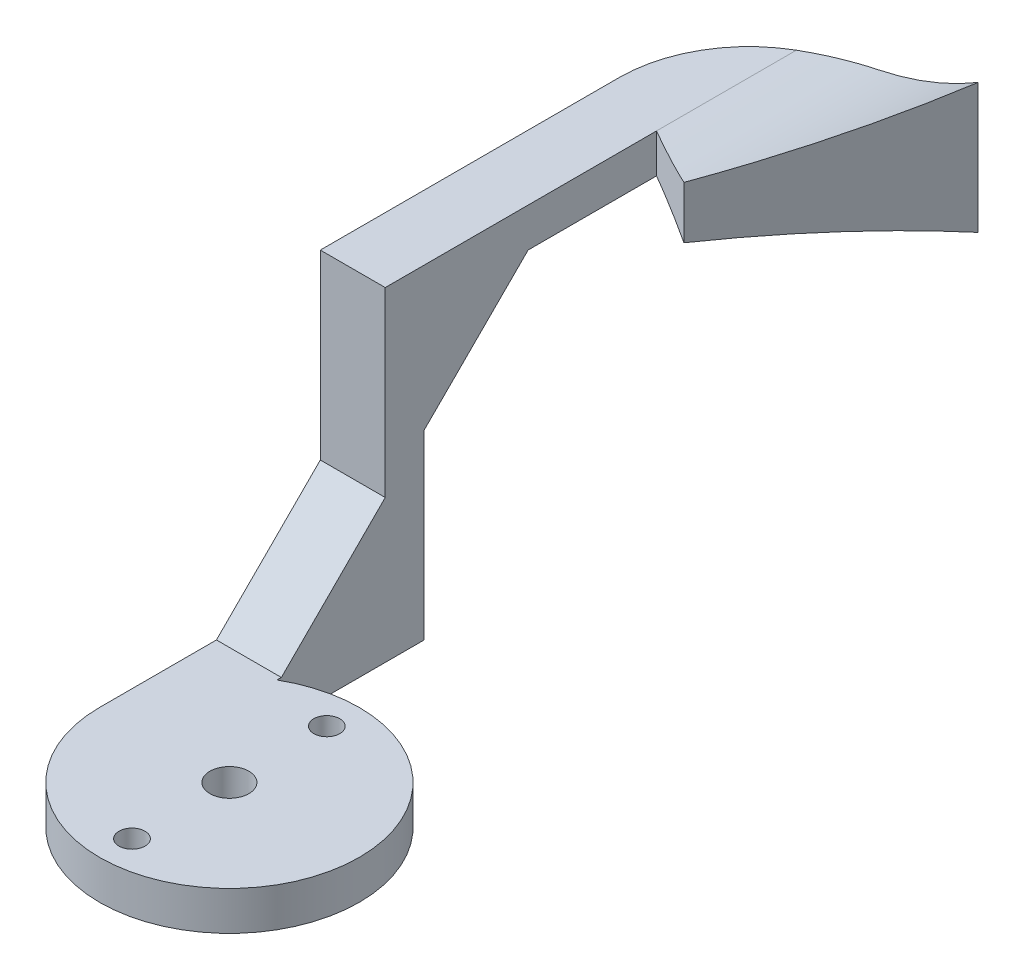
ISO-10303-21;
HEADER;
FILE_DESCRIPTION(('STEP AP214'),'2;1');
FILE_NAME('part.step','',(''),(''),'','','');
FILE_SCHEMA(('AUTOMOTIVE_DESIGN { 1 0 10303 214 1 1 1 1 }'));
ENDSEC;
DATA;
#1=APPLICATION_CONTEXT('core data for automotive mechanical design processes');
#2=APPLICATION_PROTOCOL_DEFINITION('international standard','automotive_design',2000,#1);
#3=PRODUCT_CONTEXT('',#1,'mechanical');
#4=PRODUCT('Part','Part','',(#3));
#5=PRODUCT_RELATED_PRODUCT_CATEGORY('part','',(#4));
#6=PRODUCT_DEFINITION_FORMATION('','',#4);
#7=PRODUCT_DEFINITION_CONTEXT('part definition',#1,'design');
#8=PRODUCT_DEFINITION('design','',#6,#7);
#9=PRODUCT_DEFINITION_SHAPE('','',#8);
#10=(LENGTH_UNIT() NAMED_UNIT(*) SI_UNIT(.MILLI.,.METRE.));
#11=(NAMED_UNIT(*) PLANE_ANGLE_UNIT() SI_UNIT($,.RADIAN.));
#12=(NAMED_UNIT(*) SI_UNIT($,.STERADIAN.) SOLID_ANGLE_UNIT());
#13=UNCERTAINTY_MEASURE_WITH_UNIT(LENGTH_MEASURE(1.E-05),#10,'distance_accuracy_value','');
#14=(GEOMETRIC_REPRESENTATION_CONTEXT(3) GLOBAL_UNCERTAINTY_ASSIGNED_CONTEXT((#13)) GLOBAL_UNIT_ASSIGNED_CONTEXT((#10,
#11,#12)) REPRESENTATION_CONTEXT('',''));
#15=CARTESIAN_POINT('',(0.,0.,0.));
#16=DIRECTION('',(0.,0.,1.));
#17=DIRECTION('',(1.,0.,0.));
#18=AXIS2_PLACEMENT_3D('',#15,#16,#17);
#19=CARTESIAN_POINT('',(-10.,3.,0.));
#20=DIRECTION('',(1.,0.,0.));
#21=DIRECTION('',(0.,0.,-1.));
#22=AXIS2_PLACEMENT_3D('',#19,#20,#21);
#23=PLANE('',#22);
#24=DIRECTION('',(0.,0.,-1.));
#25=VECTOR('',#24,1.);
#26=CARTESIAN_POINT('',(-10.,25.,0.));
#27=LINE('',#26,#25);
#28=CARTESIAN_POINT('',(-10.,25.,-17.));
#29=VERTEX_POINT('',#28);
#30=CARTESIAN_POINT('',(-10.,25.,-40.));
#31=VERTEX_POINT('',#30);
#32=EDGE_CURVE('E196',#29,#31,#27,.T.);
#33=ORIENTED_EDGE('',*,*,#32,.T.);
#34=DIRECTION('',(0.,1.,0.));
#35=VECTOR('',#34,1.);
#36=CARTESIAN_POINT('',(-10.,-12.4818792991333,-40.));
#37=LINE('',#36,#35);
#38=CARTESIAN_POINT('',(-10.,22.,-40.));
#39=VERTEX_POINT('',#38);
#40=EDGE_CURVE('E172',#39,#31,#37,.T.);
#41=ORIENTED_EDGE('',*,*,#40,.F.);
#42=DIRECTION('',(0.,0.,-1.));
#43=VECTOR('',#42,1.);
#44=CARTESIAN_POINT('',(-10.,22.,0.));
#45=LINE('',#44,#43);
#46=CARTESIAN_POINT('',(-10.,22.,-28.0000000000001));
#47=VERTEX_POINT('',#46);
#48=EDGE_CURVE('E198',#47,#39,#45,.T.);
#49=ORIENTED_EDGE('',*,*,#48,.F.);
#50=DIRECTION('',(0.,-0.707106781186544,0.707106781186551));
#51=VECTOR('',#50,1.);
#52=CARTESIAN_POINT('',(-10.,-2.99999999999993,-2.9999999999999));
#53=LINE('',#52,#51);
#54=CARTESIAN_POINT('',(-10.,14.,-20.));
#55=VERTEX_POINT('',#54);
#56=EDGE_CURVE('E182',#47,#55,#53,.T.);
#57=ORIENTED_EDGE('',*,*,#56,.T.);
#58=DIRECTION('',(0.,-1.,0.));
#59=VECTOR('',#58,1.);
#60=CARTESIAN_POINT('',(-10.,3.,-20.));
#61=LINE('',#60,#59);
#62=CARTESIAN_POINT('',(-10.,0.,-20.));
#63=VERTEX_POINT('',#62);
#64=EDGE_CURVE('E236',#55,#63,#61,.T.);
#65=ORIENTED_EDGE('',*,*,#64,.T.);
#66=DIRECTION('',(0.,0.,1.));
#67=VECTOR('',#66,1.);
#68=CARTESIAN_POINT('',(-10.,0.,0.));
#69=LINE('',#68,#67);
#70=CARTESIAN_POINT('',(-10.,0.,0.));
#71=VERTEX_POINT('',#70);
#72=EDGE_CURVE('E222',#63,#71,#69,.T.);
#73=ORIENTED_EDGE('',*,*,#72,.T.);
#74=DIRECTION('',(0.,-1.,0.));
#75=VECTOR('',#74,1.);
#76=CARTESIAN_POINT('',(-10.,3.,0.));
#77=LINE('',#76,#75);
#78=CARTESIAN_POINT('',(-10.,3.,0.));
#79=VERTEX_POINT('',#78);
#80=EDGE_CURVE('E226',#79,#71,#77,.T.);
#81=ORIENTED_EDGE('',*,*,#80,.F.);
#82=DIRECTION('',(0.,0.,1.));
#83=VECTOR('',#82,1.);
#84=CARTESIAN_POINT('',(-10.,3.,0.));
#85=LINE('',#84,#83);
#86=CARTESIAN_POINT('',(-10.,3.,-8.99999999999989));
#87=VERTEX_POINT('',#86);
#88=EDGE_CURVE('E224',#87,#79,#85,.T.);
#89=ORIENTED_EDGE('',*,*,#88,.F.);
#90=DIRECTION('',(0.,-0.707106781186543,0.707106781186552));
#91=VECTOR('',#90,1.);
#92=CARTESIAN_POINT('',(-10.,-2.99999999999993,-2.99999999999989));
#93=LINE('',#92,#91);
#94=CARTESIAN_POINT('',(-10.,11.,-17.));
#95=VERTEX_POINT('',#94);
#96=EDGE_CURVE('E175',#95,#87,#93,.T.);
#97=ORIENTED_EDGE('',*,*,#96,.F.);
#98=DIRECTION('',(0.,1.,0.));
#99=VECTOR('',#98,1.);
#100=CARTESIAN_POINT('',(-10.,0.,-17.));
#101=LINE('',#100,#99);
#102=EDGE_CURVE('E194',#95,#29,#101,.T.);
#103=ORIENTED_EDGE('',*,*,#102,.T.);
#104=EDGE_LOOP('',(#33,#41,#49,#57,#65,#73,#81,#89,#97,#103));
#105=FACE_BOUND('',#104,.T.);
#106=ADVANCED_FACE('F36',(#105),#23,.F.);
#107=CARTESIAN_POINT('',(0.,-12.4818792991333,-40.));
#108=DIRECTION('',(0.,1.,0.));
#109=DIRECTION('',(0.,0.,1.));
#110=AXIS2_PLACEMENT_3D('',#107,#108,#109);
#111=CYLINDRICAL_SURFACE('',#110,9.99999999999999);
#112=ORIENTED_EDGE('',*,*,#40,.T.);
#113=CARTESIAN_POINT('',(0.,25.,-40.));
#114=DIRECTION('',(0.,1.,0.));
#115=DIRECTION('',(0.,0.,1.));
#116=AXIS2_PLACEMENT_3D('',#113,#114,#115);
#117=CIRCLE('',#116,9.99999999999999);
#118=CARTESIAN_POINT('',(-5.,25.,-48.6602540378444));
#119=VERTEX_POINT('',#118);
#120=EDGE_CURVE('E168',#31,#119,#117,.F.);
#121=ORIENTED_EDGE('',*,*,#120,.T.);
#122=CARTESIAN_POINT('',(-5.00000000000001,25.,-48.6602540378444));
#123=CARTESIAN_POINT('',(-4.76780427374726,24.9999714006775,-48.794355888389));
#124=CARTESIAN_POINT('',(-4.53016700286463,25.0032883352668,-48.9190604891211));
#125=CARTESIAN_POINT('',(-4.04576558179695,25.0173383024292,-49.1489604372385));
#126=CARTESIAN_POINT('',(-3.79899883583263,25.0280734598002,-49.254150184041));
#127=CARTESIAN_POINT('',(-3.30402666138643,25.057342961331,-49.4420276477239));
#128=CARTESIAN_POINT('',(-3.05598680798396,25.075690987092,-49.5251799428243));
#129=CARTESIAN_POINT('',(-2.55497067220456,25.120592381275,-49.6716207318108));
#130=CARTESIAN_POINT('',(-2.30199620764166,25.1471427796532,-49.7349163990032));
#131=CARTESIAN_POINT('',(-1.71146035006233,25.2185925493862,-49.8584240534306));
#132=CARTESIAN_POINT('',(-1.37267522194911,25.2666437505436,-49.9112019486332));
#133=CARTESIAN_POINT('',(-0.86114244887352,25.3502638489005,-49.9643626537235));
#134=CARTESIAN_POINT('',(-0.688716605837889,25.3803416252546,-49.9777482297035));
#135=CARTESIAN_POINT('',(-0.344078285002525,25.4442662976743,-49.9955673365444));
#136=CARTESIAN_POINT('',(-0.171865836093102,25.4781136574417,-49.9999997647795));
#137=CARTESIAN_POINT('',(0.,25.5138169810337,-50.));
#138=B_SPLINE_CURVE_WITH_KNOTS('',3,(#122,#123,#124,#125,#126,#127,#128,#129,#130,#131,#132,
#133,#134,#135,#136,#137),.UNSPECIFIED.,.F.,.F.,(4,2,2,2,2,2,2,4),(0.,0.804195556242593,
1.60862155334646,2.39442372995741,3.17994170382442,4.2162091508575,4.74260477274714,
5.26906521899087),.UNSPECIFIED.);
#139=CARTESIAN_POINT('',(0.,25.5138169810337,-50.));
#140=VERTEX_POINT('',#139);
#141=EDGE_CURVE('E336',#119,#140,#138,.T.);
#142=ORIENTED_EDGE('',*,*,#141,.T.);
#143=DIRECTION('',(0.,1.,0.));
#144=VECTOR('',#143,1.);
#145=CARTESIAN_POINT('',(0.,-12.4818792991333,-50.));
#146=LINE('',#145,#144);
#147=CARTESIAN_POINT('',(0.,21.4861830189663,-50.));
#148=VERTEX_POINT('',#147);
#149=EDGE_CURVE('E176',#148,#140,#146,.T.);
#150=ORIENTED_EDGE('',*,*,#149,.F.);
#151=CARTESIAN_POINT('',(0.,21.4861830189663,-50.));
#152=CARTESIAN_POINT('',(-0.262517746514177,21.5407557705343,-50.0000415045389));
#153=CARTESIAN_POINT('',(-0.525969076046815,21.5909590292765,-49.9896640405455));
#154=CARTESIAN_POINT('',(-1.05281929866364,21.6825239117529,-49.9479242579216));
#155=CARTESIAN_POINT('',(-1.31621815667785,21.7238830677488,-49.9165560923865));
#156=CARTESIAN_POINT('',(-1.83482498523233,21.7967733666416,-49.8336581317333));
#157=CARTESIAN_POINT('',(-2.09008145645234,21.828509777686,-49.7826116569452));
#158=CARTESIAN_POINT('',(-2.59661387865083,21.8835654184981,-49.6605076110851));
#159=CARTESIAN_POINT('',(-2.84789122021869,21.9068876537427,-49.589457201437));
#160=CARTESIAN_POINT('',(-3.2601009370102,21.9389065580437,-49.4552349147342));
#161=CARTESIAN_POINT('',(-3.42268848799357,21.9498796471891,-49.3976050194521));
#162=CARTESIAN_POINT('',(-3.74485929821452,21.9684692340454,-49.2739310376327));
#163=CARTESIAN_POINT('',(-3.90444220347491,21.9760853386094,-49.2078859667352));
#164=CARTESIAN_POINT('',(-4.22253489501878,21.988226899739,-49.0664744965941));
#165=CARTESIAN_POINT('',(-4.38098897206747,21.9927022159217,-48.99097859854));
#166=CARTESIAN_POINT('',(-4.6937345730493,21.9985910016761,-48.8317426463199));
#167=CARTESIAN_POINT('',(-4.84802658554491,22.0000048321772,-48.7480035651893));
#168=CARTESIAN_POINT('',(-5.00000000000001,22.,-48.6602540378444));
#169=B_SPLINE_CURVE_WITH_KNOTS('',3,(#151,#152,#153,#154,#155,#156,#157,#158,#159,#160,#161,
#162,#163,#164,#165,#166,#167,#168),.UNSPECIFIED.,.F.,.F.,(4,2,2,2,2,2,2,2,4),(0.,
0.804192014353111,1.60860812757328,2.3944106535297,3.1799322185136,3.69823554748103,
4.21659956042801,4.74306139262274,5.26946115496264),.UNSPECIFIED.);
#170=CARTESIAN_POINT('',(-5.,22.,-48.6602540378444));
#171=VERTEX_POINT('',#170);
#172=EDGE_CURVE('E51',#148,#171,#169,.T.);
#173=ORIENTED_EDGE('',*,*,#172,.T.);
#174=CARTESIAN_POINT('',(0.,22.,-40.));
#175=DIRECTION('',(0.,-1.,0.));
#176=DIRECTION('',(0.,0.,-1.));
#177=AXIS2_PLACEMENT_3D('',#174,#175,#176);
#178=CIRCLE('',#177,9.99999999999999);
#179=EDGE_CURVE('E163',#171,#39,#178,.F.);
#180=ORIENTED_EDGE('',*,*,#179,.T.);
#181=EDGE_LOOP('',(#112,#121,#142,#150,#173,#180));
#182=FACE_BOUND('',#181,.T.);
#183=ADVANCED_FACE('F276',(#182),#111,.T.);
#184=CARTESIAN_POINT('',(-5.,22.,0.));
#185=DIRECTION('',(0.,1.,0.));
#186=DIRECTION('',(0.,0.,1.));
#187=AXIS2_PLACEMENT_3D('',#184,#185,#186);
#188=PLANE('',#187);
#189=ORIENTED_EDGE('',*,*,#48,.T.);
#190=ORIENTED_EDGE('',*,*,#179,.F.);
#191=DIRECTION('',(0.,0.,1.));
#192=VECTOR('',#191,1.);
#193=CARTESIAN_POINT('',(-5.,22.,-50.));
#194=LINE('',#193,#192);
#195=CARTESIAN_POINT('',(-5.,22.,-37.8867513459482));
#196=VERTEX_POINT('',#195);
#197=EDGE_CURVE('E282',#171,#196,#194,.T.);
#198=ORIENTED_EDGE('',*,*,#197,.T.);
#199=DIRECTION('',(0.,0.,-1.));
#200=VECTOR('',#199,1.);
#201=CARTESIAN_POINT('',(-5.,22.,0.));
#202=LINE('',#201,#200);
#203=CARTESIAN_POINT('',(-5.,22.,-28.0000000000001));
#204=VERTEX_POINT('',#203);
#205=EDGE_CURVE('E186',#204,#196,#202,.T.);
#206=ORIENTED_EDGE('',*,*,#205,.F.);
#207=DIRECTION('',(-1.,0.,0.));
#208=VECTOR('',#207,1.);
#209=CARTESIAN_POINT('',(-5.,22.,-28.0000000000001));
#210=LINE('',#209,#208);
#211=EDGE_CURVE('E206',#204,#47,#210,.T.);
#212=ORIENTED_EDGE('',*,*,#211,.T.);
#213=EDGE_LOOP('',(#189,#190,#198,#206,#212));
#214=FACE_BOUND('',#213,.T.);
#215=ADVANCED_FACE('F280',(#214),#188,.F.);
#216=CARTESIAN_POINT('',(-5.,25.,0.));
#217=DIRECTION('',(0.,1.,0.));
#218=DIRECTION('',(0.,0.,1.));
#219=AXIS2_PLACEMENT_3D('',#216,#217,#218);
#220=PLANE('',#219);
#221=DIRECTION('',(0.,0.,-1.));
#222=VECTOR('',#221,1.);
#223=CARTESIAN_POINT('',(-5.,25.,0.));
#224=LINE('',#223,#222);
#225=CARTESIAN_POINT('',(-5.,25.,-17.));
#226=VERTEX_POINT('',#225);
#227=CARTESIAN_POINT('',(-5.,25.,-37.8867513459482));
#228=VERTEX_POINT('',#227);
#229=EDGE_CURVE('E184',#226,#228,#224,.T.);
#230=ORIENTED_EDGE('',*,*,#229,.T.);
#231=DIRECTION('',(0.,0.,1.));
#232=VECTOR('',#231,1.);
#233=CARTESIAN_POINT('',(-5.,25.,-50.));
#234=LINE('',#233,#232);
#235=EDGE_CURVE('E158',#119,#228,#234,.T.);
#236=ORIENTED_EDGE('',*,*,#235,.F.);
#237=ORIENTED_EDGE('',*,*,#120,.F.);
#238=ORIENTED_EDGE('',*,*,#32,.F.);
#239=DIRECTION('',(-1.,0.,0.));
#240=VECTOR('',#239,1.);
#241=CARTESIAN_POINT('',(-5.,25.,-17.));
#242=LINE('',#241,#240);
#243=EDGE_CURVE('E208',#226,#29,#242,.T.);
#244=ORIENTED_EDGE('',*,*,#243,.F.);
#245=EDGE_LOOP('',(#230,#236,#237,#238,#244));
#246=FACE_BOUND('',#245,.T.);
#247=ADVANCED_FACE('F269',(#246),#220,.T.);
#248=CARTESIAN_POINT('',(0.,3.,0.));
#249=DIRECTION('',(0.,1.,0.));
#250=DIRECTION('',(0.,0.,1.));
#251=AXIS2_PLACEMENT_3D('',#248,#249,#250);
#252=PLANE('',#251);
#253=CARTESIAN_POINT('',(0.,3.,-7.5));
#254=DIRECTION('',(0.,1.,0.));
#255=DIRECTION('',(0.,0.,1.));
#256=AXIS2_PLACEMENT_3D('',#253,#254,#255);
#257=CIRCLE('',#256,1.);
#258=CARTESIAN_POINT('',(0.,3.,-8.5));
#259=VERTEX_POINT('',#258);
#260=EDGE_CURVE('E147',#259,#259,#257,.T.);
#261=ORIENTED_EDGE('',*,*,#260,.F.);
#262=EDGE_LOOP('',(#261));
#263=FACE_BOUND('',#262,.T.);
#264=CARTESIAN_POINT('',(0.,3.,7.5));
#265=DIRECTION('',(0.,1.,0.));
#266=DIRECTION('',(0.,0.,1.));
#267=AXIS2_PLACEMENT_3D('',#264,#265,#266);
#268=CIRCLE('',#267,1.);
#269=CARTESIAN_POINT('',(0.,3.,6.5));
#270=VERTEX_POINT('',#269);
#271=EDGE_CURVE('E549',#270,#270,#268,.T.);
#272=ORIENTED_EDGE('',*,*,#271,.F.);
#273=EDGE_LOOP('',(#272));
#274=FACE_BOUND('',#273,.T.);
#275=CARTESIAN_POINT('',(0.,3.,0.));
#276=DIRECTION('',(0.,1.,0.));
#277=DIRECTION('',(0.,0.,1.));
#278=AXIS2_PLACEMENT_3D('',#275,#276,#277);
#279=CIRCLE('',#278,1.5);
#280=CARTESIAN_POINT('',(0.,3.,1.5));
#281=VERTEX_POINT('',#280);
#282=EDGE_CURVE('E214',#281,#281,#279,.T.);
#283=ORIENTED_EDGE('',*,*,#282,.F.);
#284=EDGE_LOOP('',(#283));
#285=FACE_BOUND('',#284,.T.);
#286=DIRECTION('',(0.,0.,-1.));
#287=VECTOR('',#286,1.);
#288=CARTESIAN_POINT('',(-5.,3.,-20.));
#289=LINE('',#288,#287);
#290=CARTESIAN_POINT('',(-5.,3.,-8.66025403784439));
#291=VERTEX_POINT('',#290);
#292=CARTESIAN_POINT('',(-5.,3.,-8.99999999999989));
#293=VERTEX_POINT('',#292);
#294=EDGE_CURVE('E59',#291,#293,#289,.T.);
#295=ORIENTED_EDGE('',*,*,#294,.T.);
#296=DIRECTION('',(-1.,0.,0.));
#297=VECTOR('',#296,1.);
#298=CARTESIAN_POINT('',(-5.,3.,-8.99999999999989));
#299=LINE('',#298,#297);
#300=EDGE_CURVE('E191',#293,#87,#299,.T.);
#301=ORIENTED_EDGE('',*,*,#300,.T.);
#302=ORIENTED_EDGE('',*,*,#88,.T.);
#303=CARTESIAN_POINT('',(0.,3.,0.));
#304=DIRECTION('',(0.,1.,0.));
#305=DIRECTION('',(0.,0.,1.));
#306=AXIS2_PLACEMENT_3D('',#303,#304,#305);
#307=CIRCLE('',#306,10.);
#308=EDGE_CURVE('E220',#79,#291,#307,.T.);
#309=ORIENTED_EDGE('',*,*,#308,.T.);
#310=EDGE_LOOP('',(#295,#301,#302,#309));
#311=FACE_BOUND('',#310,.T.);
#312=ADVANCED_FACE('F255',(#263,#274,#285,#311),#252,.T.);
#313=CARTESIAN_POINT('',(0.,0.,0.));
#314=DIRECTION('',(0.,1.,0.));
#315=DIRECTION('',(0.,0.,1.));
#316=AXIS2_PLACEMENT_3D('',#313,#314,#315);
#317=PLANE('',#316);
#318=CARTESIAN_POINT('',(0.,0.,-7.5));
#319=DIRECTION('',(0.,-1.,0.));
#320=DIRECTION('',(0.,0.,-1.));
#321=AXIS2_PLACEMENT_3D('',#318,#319,#320);
#322=CIRCLE('',#321,1.);
#323=CARTESIAN_POINT('',(0.,0.,-8.5));
#324=VERTEX_POINT('',#323);
#325=EDGE_CURVE('E543',#324,#324,#322,.T.);
#326=ORIENTED_EDGE('',*,*,#325,.F.);
#327=EDGE_LOOP('',(#326));
#328=FACE_BOUND('',#327,.T.);
#329=CARTESIAN_POINT('',(0.,0.,7.5));
#330=DIRECTION('',(0.,-1.,0.));
#331=DIRECTION('',(0.,0.,-1.));
#332=AXIS2_PLACEMENT_3D('',#329,#330,#331);
#333=CIRCLE('',#332,1.);
#334=CARTESIAN_POINT('',(0.,0.,6.5));
#335=VERTEX_POINT('',#334);
#336=EDGE_CURVE('E546',#335,#335,#333,.T.);
#337=ORIENTED_EDGE('',*,*,#336,.F.);
#338=EDGE_LOOP('',(#337));
#339=FACE_BOUND('',#338,.T.);
#340=DIRECTION('',(-1.,0.,0.));
#341=VECTOR('',#340,1.);
#342=CARTESIAN_POINT('',(-10.,0.,-20.));
#343=LINE('',#342,#341);
#344=CARTESIAN_POINT('',(-5.,0.,-20.));
#345=VERTEX_POINT('',#344);
#346=EDGE_CURVE('E231',#345,#63,#343,.T.);
#347=ORIENTED_EDGE('',*,*,#346,.F.);
#348=DIRECTION('',(0.,0.,-1.));
#349=VECTOR('',#348,1.);
#350=CARTESIAN_POINT('',(-5.,0.,-20.));
#351=LINE('',#350,#349);
#352=CARTESIAN_POINT('',(-5.,0.,-8.66025403784439));
#353=VERTEX_POINT('',#352);
#354=EDGE_CURVE('E229',#353,#345,#351,.T.);
#355=ORIENTED_EDGE('',*,*,#354,.F.);
#356=CARTESIAN_POINT('',(0.,0.,0.));
#357=DIRECTION('',(0.,1.,0.));
#358=DIRECTION('',(0.,0.,1.));
#359=AXIS2_PLACEMENT_3D('',#356,#357,#358);
#360=CIRCLE('',#359,10.);
#361=EDGE_CURVE('E217',#71,#353,#360,.T.);
#362=ORIENTED_EDGE('',*,*,#361,.F.);
#363=ORIENTED_EDGE('',*,*,#72,.F.);
#364=EDGE_LOOP('',(#347,#355,#362,#363));
#365=FACE_BOUND('',#364,.T.);
#366=CARTESIAN_POINT('',(0.,0.,0.));
#367=DIRECTION('',(0.,1.,0.));
#368=DIRECTION('',(0.,0.,1.));
#369=AXIS2_PLACEMENT_3D('',#366,#367,#368);
#370=CIRCLE('',#369,1.5);
#371=CARTESIAN_POINT('',(0.,0.,1.5));
#372=VERTEX_POINT('',#371);
#373=EDGE_CURVE('E205',#372,#372,#370,.T.);
#374=ORIENTED_EDGE('',*,*,#373,.T.);
#375=EDGE_LOOP('',(#374));
#376=FACE_BOUND('',#375,.T.);
#377=ADVANCED_FACE('F247',(#328,#339,#365,#376),#317,.F.);
#378=CARTESIAN_POINT('',(0.,3.,0.));
#379=DIRECTION('',(0.,-1.,0.));
#380=DIRECTION('',(0.,0.,-1.));
#381=AXIS2_PLACEMENT_3D('',#378,#379,#380);
#382=CYLINDRICAL_SURFACE('',#381,10.);
#383=ORIENTED_EDGE('',*,*,#361,.T.);
#384=DIRECTION('',(0.,-1.,0.));
#385=VECTOR('',#384,1.);
#386=CARTESIAN_POINT('',(-5.,3.,-8.66025403784439));
#387=LINE('',#386,#385);
#388=EDGE_CURVE('E12',#291,#353,#387,.T.);
#389=ORIENTED_EDGE('',*,*,#388,.F.);
#390=ORIENTED_EDGE('',*,*,#308,.F.);
#391=ORIENTED_EDGE('',*,*,#80,.T.);
#392=EDGE_LOOP('',(#383,#389,#390,#391));
#393=FACE_BOUND('',#392,.T.);
#394=ADVANCED_FACE('F38',(#393),#382,.T.);
#395=CARTESIAN_POINT('',(-5.,3.,-20.));
#396=DIRECTION('',(-1.,0.,0.));
#397=DIRECTION('',(0.,0.,1.));
#398=AXIS2_PLACEMENT_3D('',#395,#396,#397);
#399=PLANE('',#398);
#400=ORIENTED_EDGE('',*,*,#229,.F.);
#401=DIRECTION('',(0.,1.,0.));
#402=VECTOR('',#401,1.);
#403=CARTESIAN_POINT('',(-5.,0.,-17.));
#404=LINE('',#403,#402);
#405=CARTESIAN_POINT('',(-5.,11.,-17.));
#406=VERTEX_POINT('',#405);
#407=EDGE_CURVE('E181',#406,#226,#404,.T.);
#408=ORIENTED_EDGE('',*,*,#407,.F.);
#409=DIRECTION('',(0.,-0.707106781186543,0.707106781186552));
#410=VECTOR('',#409,1.);
#411=CARTESIAN_POINT('',(-5.,-2.99999999999993,-2.99999999999989));
#412=LINE('',#411,#410);
#413=EDGE_CURVE('E179',#406,#293,#412,.T.);
#414=ORIENTED_EDGE('',*,*,#413,.T.);
#415=ORIENTED_EDGE('',*,*,#294,.F.);
#416=ORIENTED_EDGE('',*,*,#388,.T.);
#417=ORIENTED_EDGE('',*,*,#354,.T.);
#418=DIRECTION('',(0.,-1.,0.));
#419=VECTOR('',#418,1.);
#420=CARTESIAN_POINT('',(-5.,3.,-20.));
#421=LINE('',#420,#419);
#422=CARTESIAN_POINT('',(-5.,14.,-20.));
#423=VERTEX_POINT('',#422);
#424=EDGE_CURVE('E44',#423,#345,#421,.T.);
#425=ORIENTED_EDGE('',*,*,#424,.F.);
#426=DIRECTION('',(0.,-0.707106781186544,0.707106781186551));
#427=VECTOR('',#426,1.);
#428=CARTESIAN_POINT('',(-5.,-2.99999999999993,-2.9999999999999));
#429=LINE('',#428,#427);
#430=EDGE_CURVE('E188',#204,#423,#429,.T.);
#431=ORIENTED_EDGE('',*,*,#430,.F.);
#432=ORIENTED_EDGE('',*,*,#205,.T.);
#433=DIRECTION('',(0.,1.,0.));
#434=VECTOR('',#433,1.);
#435=CARTESIAN_POINT('',(-5.,-12.4818792991333,-37.8867513459482));
#436=LINE('',#435,#434);
#437=EDGE_CURVE('E162',#196,#228,#436,.T.);
#438=ORIENTED_EDGE('',*,*,#437,.T.);
#439=EDGE_LOOP('',(#400,#408,#414,#415,#416,#417,#425,#431,#432,#438));
#440=FACE_BOUND('',#439,.T.);
#441=ADVANCED_FACE('F328',(#440),#399,.F.);
#442=CARTESIAN_POINT('',(-10.,3.,-20.));
#443=DIRECTION('',(0.,0.,1.));
#444=DIRECTION('',(1.,0.,0.));
#445=AXIS2_PLACEMENT_3D('',#442,#443,#444);
#446=PLANE('',#445);
#447=ORIENTED_EDGE('',*,*,#346,.T.);
#448=ORIENTED_EDGE('',*,*,#64,.F.);
#449=DIRECTION('',(-1.,0.,0.));
#450=VECTOR('',#449,1.);
#451=CARTESIAN_POINT('',(-5.,14.,-20.));
#452=LINE('',#451,#450);
#453=EDGE_CURVE('E202',#423,#55,#452,.T.);
#454=ORIENTED_EDGE('',*,*,#453,.F.);
#455=ORIENTED_EDGE('',*,*,#424,.T.);
#456=EDGE_LOOP('',(#447,#448,#454,#455));
#457=FACE_BOUND('',#456,.T.);
#458=ADVANCED_FACE('F242',(#457),#446,.F.);
#459=CARTESIAN_POINT('',(0.,3.,0.));
#460=DIRECTION('',(0.,-1.,0.));
#461=DIRECTION('',(0.,0.,-1.));
#462=AXIS2_PLACEMENT_3D('',#459,#460,#461);
#463=CYLINDRICAL_SURFACE('',#462,1.5);
#464=ORIENTED_EDGE('',*,*,#282,.T.);
#465=EDGE_LOOP('',(#464));
#466=FACE_BOUND('',#465,.T.);
#467=ORIENTED_EDGE('',*,*,#373,.F.);
#468=EDGE_LOOP('',(#467));
#469=FACE_BOUND('',#468,.T.);
#470=ADVANCED_FACE('F327',(#466,#469),#463,.F.);
#471=CARTESIAN_POINT('',(-5.,-2.99999999999993,-2.9999999999999));
#472=DIRECTION('',(0.,-0.707106781186551,-0.707106781186544));
#473=DIRECTION('',(0.,0.707106781186544,-0.707106781186551));
#474=AXIS2_PLACEMENT_3D('',#471,#472,#473);
#475=PLANE('',#474);
#476=ORIENTED_EDGE('',*,*,#56,.F.);
#477=ORIENTED_EDGE('',*,*,#211,.F.);
#478=ORIENTED_EDGE('',*,*,#430,.T.);
#479=ORIENTED_EDGE('',*,*,#453,.T.);
#480=EDGE_LOOP('',(#476,#477,#478,#479));
#481=FACE_BOUND('',#480,.T.);
#482=ADVANCED_FACE('F445',(#481),#475,.T.);
#483=CARTESIAN_POINT('',(-5.,0.,-17.));
#484=DIRECTION('',(0.,0.,1.));
#485=DIRECTION('',(1.,0.,0.));
#486=AXIS2_PLACEMENT_3D('',#483,#484,#485);
#487=PLANE('',#486);
#488=ORIENTED_EDGE('',*,*,#243,.T.);
#489=ORIENTED_EDGE('',*,*,#102,.F.);
#490=DIRECTION('',(-1.,0.,0.));
#491=VECTOR('',#490,1.);
#492=CARTESIAN_POINT('',(-5.,11.,-17.));
#493=LINE('',#492,#491);
#494=EDGE_CURVE('E211',#406,#95,#493,.T.);
#495=ORIENTED_EDGE('',*,*,#494,.F.);
#496=ORIENTED_EDGE('',*,*,#407,.T.);
#497=EDGE_LOOP('',(#488,#489,#495,#496));
#498=FACE_BOUND('',#497,.T.);
#499=ADVANCED_FACE('F261',(#498),#487,.T.);
#500=CARTESIAN_POINT('',(-5.,-2.99999999999993,-2.99999999999989));
#501=DIRECTION('',(0.,-0.707106781186552,-0.707106781186543));
#502=DIRECTION('',(0.,0.707106781186543,-0.707106781186552));
#503=AXIS2_PLACEMENT_3D('',#500,#501,#502);
#504=PLANE('',#503);
#505=ORIENTED_EDGE('',*,*,#96,.T.);
#506=ORIENTED_EDGE('',*,*,#300,.F.);
#507=ORIENTED_EDGE('',*,*,#413,.F.);
#508=ORIENTED_EDGE('',*,*,#494,.T.);
#509=EDGE_LOOP('',(#505,#506,#507,#508));
#510=FACE_BOUND('',#509,.T.);
#511=ADVANCED_FACE('F316',(#510),#504,.F.);
#512=CARTESIAN_POINT('',(0.,-12.4818792991333,-35.));
#513=DIRECTION('',(-0.500000000000004,0.,0.866025403784436));
#514=DIRECTION('',(0.866025403784437,0.,0.500000000000004));
#515=AXIS2_PLACEMENT_3D('',#512,#513,#514);
#516=PLANE('',#515);
#517=DIRECTION('',(0.,1.,0.));
#518=VECTOR('',#517,1.);
#519=CARTESIAN_POINT('',(0.,-12.4818792991333,-35.));
#520=LINE('',#519,#518);
#521=CARTESIAN_POINT('',(0.,21.4861830189663,-35.));
#522=VERTEX_POINT('',#521);
#523=CARTESIAN_POINT('',(0.,25.5138169810337,-35.));
#524=VERTEX_POINT('',#523);
#525=EDGE_CURVE('E156',#522,#524,#520,.T.);
#526=ORIENTED_EDGE('',*,*,#525,.T.);
#527=CARTESIAN_POINT('',(-5.,49.5846369646753,-37.8867513459482));
#528=DIRECTION('',(-0.500000000000004,0.,0.866025403784436));
#529=DIRECTION('',(0.866025403784437,0.,0.500000000000004));
#530=AXIS2_PLACEMENT_3D('',#527,#528,#529);
#531=ELLIPSE('',#530,28.3878935389691,24.5846369646753);
#532=EDGE_CURVE('E335',#524,#228,#531,.F.);
#533=ORIENTED_EDGE('',*,*,#532,.T.);
#534=ORIENTED_EDGE('',*,*,#437,.F.);
#535=CARTESIAN_POINT('',(-4.99999999999999,-2.58463696467534,-37.8867513459482));
#536=DIRECTION('',(-0.500000000000004,0.,0.866025403784436));
#537=DIRECTION('',(0.866025403784437,0.,0.500000000000004));
#538=AXIS2_PLACEMENT_3D('',#535,#536,#537);
#539=ELLIPSE('',#538,28.3878935389691,24.5846369646753);
#540=EDGE_CURVE('E157',#196,#522,#539,.F.);
#541=ORIENTED_EDGE('',*,*,#540,.T.);
#542=EDGE_LOOP('',(#526,#533,#534,#541));
#543=FACE_BOUND('',#542,.T.);
#544=ADVANCED_FACE('F312',(#543),#516,.T.);
#545=CARTESIAN_POINT('',(7.64288174241645,28.5,-50.));
#546=DIRECTION('',(-0.891006524188367,0.,-0.453990499739548));
#547=DIRECTION('',(-0.453990499739548,0.,0.891006524188367));
#548=AXIS2_PLACEMENT_3D('',#545,#546,#547);
#549=PLANE('',#548);
#550=CARTESIAN_POINT('',(-5.,49.5846369646753,-25.1869474724743));
#551=DIRECTION('',(-0.891006524188367,0.,-0.453990499739548));
#552=DIRECTION('',(-0.453990499739548,0.,0.891006524188367));
#553=AXIS2_PLACEMENT_3D('',#550,#551,#552);
#554=ELLIPSE('',#553,54.1523159158164,24.5846369646753);
#555=CARTESIAN_POINT('',(7.64288174241646,28.5,-50.));
#556=VERTEX_POINT('',#555);
#557=EDGE_CURVE('E297',#524,#556,#554,.F.);
#558=ORIENTED_EDGE('',*,*,#557,.F.);
#559=ORIENTED_EDGE('',*,*,#525,.F.);
#560=CARTESIAN_POINT('',(-4.99999999999999,-2.58463696467534,-25.1869474724743));
#561=DIRECTION('',(-0.891006524188367,0.,-0.453990499739548));
#562=DIRECTION('',(-0.453990499739548,0.,0.891006524188367));
#563=AXIS2_PLACEMENT_3D('',#560,#561,#562);
#564=ELLIPSE('',#563,54.1523159158163,24.5846369646753);
#565=CARTESIAN_POINT('',(7.64288174241645,18.5,-50.));
#566=VERTEX_POINT('',#565);
#567=EDGE_CURVE('E140',#566,#522,#564,.F.);
#568=ORIENTED_EDGE('',*,*,#567,.F.);
#569=DIRECTION('',(0.,-1.,0.));
#570=VECTOR('',#569,1.);
#571=CARTESIAN_POINT('',(7.64288174241645,28.5,-50.));
#572=LINE('',#571,#570);
#573=EDGE_CURVE('E154',#556,#566,#572,.T.);
#574=ORIENTED_EDGE('',*,*,#573,.F.);
#575=EDGE_LOOP('',(#558,#559,#568,#574));
#576=FACE_BOUND('',#575,.T.);
#577=ADVANCED_FACE('F153',(#576),#549,.F.);
#578=CARTESIAN_POINT('',(0.,28.5,-50.));
#579=DIRECTION('',(0.,0.,1.));
#580=DIRECTION('',(1.,0.,0.));
#581=AXIS2_PLACEMENT_3D('',#578,#579,#580);
#582=PLANE('',#581);
#583=CARTESIAN_POINT('',(-5.,49.5846369646753,-50.));
#584=DIRECTION('',(0.,0.,-1.));
#585=DIRECTION('',(1.,0.,0.));
#586=AXIS2_PLACEMENT_3D('',#583,#584,#585);
#587=CIRCLE('',#586,24.5846369646753);
#588=EDGE_CURVE('E146',#556,#140,#587,.T.);
#589=ORIENTED_EDGE('',*,*,#588,.F.);
#590=ORIENTED_EDGE('',*,*,#573,.T.);
#591=CARTESIAN_POINT('',(-4.99999999999999,-2.58463696467534,-50.));
#592=DIRECTION('',(0.,0.,-1.));
#593=DIRECTION('',(-1.,0.,0.));
#594=AXIS2_PLACEMENT_3D('',#591,#592,#593);
#595=CIRCLE('',#594,24.5846369646753);
#596=EDGE_CURVE('E136',#148,#566,#595,.T.);
#597=ORIENTED_EDGE('',*,*,#596,.F.);
#598=ORIENTED_EDGE('',*,*,#149,.T.);
#599=EDGE_LOOP('',(#589,#590,#597,#598));
#600=FACE_BOUND('',#599,.T.);
#601=ADVANCED_FACE('F161',(#600),#582,.F.);
#602=CARTESIAN_POINT('',(-5.,49.5846369646753,-50.));
#603=DIRECTION('',(0.,0.,1.));
#604=DIRECTION('',(1.,0.,0.));
#605=AXIS2_PLACEMENT_3D('',#602,#603,#604);
#606=CYLINDRICAL_SURFACE('',#605,24.5846369646753);
#607=ORIENTED_EDGE('',*,*,#235,.T.);
#608=ORIENTED_EDGE('',*,*,#532,.F.);
#609=ORIENTED_EDGE('',*,*,#557,.T.);
#610=ORIENTED_EDGE('',*,*,#588,.T.);
#611=ORIENTED_EDGE('',*,*,#141,.F.);
#612=EDGE_LOOP('',(#607,#608,#609,#610,#611));
#613=FACE_BOUND('',#612,.T.);
#614=ADVANCED_FACE('F307',(#613),#606,.F.);
#615=CARTESIAN_POINT('',(-4.99999999999999,-2.58463696467534,-50.));
#616=DIRECTION('',(0.,0.,1.));
#617=DIRECTION('',(1.,0.,0.));
#618=AXIS2_PLACEMENT_3D('',#615,#616,#617);
#619=CYLINDRICAL_SURFACE('',#618,24.5846369646753);
#620=ORIENTED_EDGE('',*,*,#596,.T.);
#621=ORIENTED_EDGE('',*,*,#567,.T.);
#622=ORIENTED_EDGE('',*,*,#540,.F.);
#623=ORIENTED_EDGE('',*,*,#197,.F.);
#624=ORIENTED_EDGE('',*,*,#172,.F.);
#625=EDGE_LOOP('',(#620,#621,#622,#623,#624));
#626=FACE_BOUND('',#625,.T.);
#627=ADVANCED_FACE('F138',(#626),#619,.F.);
#628=CARTESIAN_POINT('',(0.,28.5,7.5));
#629=DIRECTION('',(0.,-1.,0.));
#630=DIRECTION('',(0.,0.,-1.));
#631=AXIS2_PLACEMENT_3D('',#628,#629,#630);
#632=CYLINDRICAL_SURFACE('',#631,1.);
#633=CARTESIAN_POINT('',(0.,3.,6.5));
#634=CARTESIAN_POINT('',(0.,2.96875,6.5));
#635=CARTESIAN_POINT('',(0.,2.9375,6.5));
#636=CARTESIAN_POINT('',(0.,2.875,6.5));
#637=CARTESIAN_POINT('',(0.,2.84375,6.5));
#638=CARTESIAN_POINT('',(0.,2.78125,6.5));
#639=CARTESIAN_POINT('',(0.,2.75,6.5));
#640=CARTESIAN_POINT('',(0.,2.6875,6.5));
#641=CARTESIAN_POINT('',(0.,2.65625,6.5));
#642=CARTESIAN_POINT('',(0.,2.59375,6.5));
#643=CARTESIAN_POINT('',(0.,2.5625,6.5));
#644=CARTESIAN_POINT('',(0.,2.5,6.5));
#645=CARTESIAN_POINT('',(0.,2.46875,6.5));
#646=CARTESIAN_POINT('',(0.,2.40625,6.5));
#647=CARTESIAN_POINT('',(0.,2.375,6.5));
#648=CARTESIAN_POINT('',(0.,2.3125,6.5));
#649=CARTESIAN_POINT('',(0.,2.28125,6.5));
#650=CARTESIAN_POINT('',(0.,2.21875,6.5));
#651=CARTESIAN_POINT('',(0.,2.1875,6.5));
#652=CARTESIAN_POINT('',(0.,2.125,6.5));
#653=CARTESIAN_POINT('',(0.,2.09375,6.5));
#654=CARTESIAN_POINT('',(0.,2.03125,6.5));
#655=CARTESIAN_POINT('',(0.,2.,6.5));
#656=CARTESIAN_POINT('',(0.,1.9375,6.5));
#657=CARTESIAN_POINT('',(0.,1.90625,6.5));
#658=CARTESIAN_POINT('',(0.,1.84375,6.5));
#659=CARTESIAN_POINT('',(0.,1.8125,6.5));
#660=CARTESIAN_POINT('',(0.,1.75,6.5));
#661=CARTESIAN_POINT('',(0.,1.71875,6.5));
#662=CARTESIAN_POINT('',(0.,1.65625,6.5));
#663=CARTESIAN_POINT('',(0.,1.625,6.5));
#664=CARTESIAN_POINT('',(0.,1.5625,6.5));
#665=CARTESIAN_POINT('',(0.,1.53125,6.5));
#666=CARTESIAN_POINT('',(0.,1.46875,6.5));
#667=CARTESIAN_POINT('',(0.,1.4375,6.5));
#668=CARTESIAN_POINT('',(0.,1.375,6.5));
#669=CARTESIAN_POINT('',(0.,1.34375,6.5));
#670=CARTESIAN_POINT('',(0.,1.28125,6.5));
#671=CARTESIAN_POINT('',(0.,1.25,6.5));
#672=CARTESIAN_POINT('',(0.,1.1875,6.5));
#673=CARTESIAN_POINT('',(0.,1.15625,6.5));
#674=CARTESIAN_POINT('',(0.,1.09375,6.5));
#675=CARTESIAN_POINT('',(0.,1.0625,6.5));
#676=CARTESIAN_POINT('',(0.,0.999999999999997,6.5));
#677=CARTESIAN_POINT('',(0.,0.968749999999997,6.5));
#678=CARTESIAN_POINT('',(0.,0.906249999999997,6.5));
#679=CARTESIAN_POINT('',(0.,0.874999999999997,6.5));
#680=CARTESIAN_POINT('',(0.,0.812499999999998,6.5));
#681=CARTESIAN_POINT('',(0.,0.78125,6.5));
#682=CARTESIAN_POINT('',(0.,0.718749999999999,6.5));
#683=CARTESIAN_POINT('',(0.,0.687499999999998,6.5));
#684=CARTESIAN_POINT('',(0.,0.624999999999998,6.5));
#685=CARTESIAN_POINT('',(0.,0.593749999999999,6.5));
#686=CARTESIAN_POINT('',(0.,0.53125,6.5));
#687=CARTESIAN_POINT('',(0.,0.5,6.5));
#688=CARTESIAN_POINT('',(0.,0.4375,6.5));
#689=CARTESIAN_POINT('',(0.,0.40625,6.5));
#690=CARTESIAN_POINT('',(0.,0.34375,6.5));
#691=CARTESIAN_POINT('',(0.,0.3125,6.5));
#692=CARTESIAN_POINT('',(0.,0.25,6.5));
#693=CARTESIAN_POINT('',(0.,0.21875,6.5));
#694=CARTESIAN_POINT('',(0.,0.15625,6.5));
#695=CARTESIAN_POINT('',(0.,0.125,6.5));
#696=CARTESIAN_POINT('',(0.,0.0625000000000001,6.5));
#697=CARTESIAN_POINT('',(0.,0.03125,6.5));
#698=CARTESIAN_POINT('',(0.,0.,6.5));
#699=B_SPLINE_CURVE_WITH_KNOTS('',3,(#633,#634,#635,#636,#637,#638,#639,#640,#641,#642,#643,
#644,#645,#646,#647,#648,#649,#650,#651,#652,#653,#654,#655,#656,#657,#658,#659,#660,#661,#662,
#663,#664,#665,#666,#667,#668,#669,#670,#671,#672,#673,#674,#675,#676,#677,#678,#679,#680,#681,
#682,#683,#684,#685,#686,#687,#688,#689,#690,#691,#692,#693,#694,#695,#696,#697,#698),
.UNSPECIFIED.,.F.,.F.,(4,2,2,2,2,2,2,2,2,2,2,2,2,2,2,2,2,2,2,2,2,2,2,2,2,2,2,2,2,2,2,2,4),(0.,
0.0937500000000001,0.1875,0.28125,0.375,0.46875,0.5625,0.656250000000001,0.750000000000001,
0.843749999999997,0.937499999999997,1.03125,1.125,1.21875,1.3125,1.40625,1.5,1.59375,1.6875,
1.78125,1.875,1.96875,2.0625,2.15625,2.25,2.34375,2.4375,2.53125,2.625,2.71875,2.8125,2.90625,
3.),.UNSPECIFIED.);
#700=EDGE_CURVE('BSEAM306',#270,#335,#699,.T.);
#701=ORIENTED_EDGE('',*,*,#271,.T.);
#702=ORIENTED_EDGE('',*,*,#336,.T.);
#703=ORIENTED_EDGE('',*,*,#700,.T.);
#704=ORIENTED_EDGE('',*,*,#700,.F.);
#705=EDGE_LOOP('',(#701,#703,#702,#704));
#706=FACE_BOUND('',#705,.T.);
#707=ADVANCED_FACE('F306',(#706),#632,.F.);
#708=CARTESIAN_POINT('',(0.,28.5,-7.5));
#709=DIRECTION('',(0.,-1.,0.));
#710=DIRECTION('',(0.,0.,-1.));
#711=AXIS2_PLACEMENT_3D('',#708,#709,#710);
#712=CYLINDRICAL_SURFACE('',#711,1.);
#713=CARTESIAN_POINT('',(0.,3.,-8.5));
#714=CARTESIAN_POINT('',(0.,2.96875,-8.5));
#715=CARTESIAN_POINT('',(0.,2.9375,-8.5));
#716=CARTESIAN_POINT('',(0.,2.875,-8.5));
#717=CARTESIAN_POINT('',(0.,2.84375,-8.5));
#718=CARTESIAN_POINT('',(0.,2.78125,-8.5));
#719=CARTESIAN_POINT('',(0.,2.75,-8.5));
#720=CARTESIAN_POINT('',(0.,2.6875,-8.5));
#721=CARTESIAN_POINT('',(0.,2.65625,-8.5));
#722=CARTESIAN_POINT('',(0.,2.59375,-8.5));
#723=CARTESIAN_POINT('',(0.,2.5625,-8.5));
#724=CARTESIAN_POINT('',(0.,2.5,-8.5));
#725=CARTESIAN_POINT('',(0.,2.46875,-8.5));
#726=CARTESIAN_POINT('',(0.,2.40625,-8.5));
#727=CARTESIAN_POINT('',(0.,2.375,-8.5));
#728=CARTESIAN_POINT('',(0.,2.3125,-8.5));
#729=CARTESIAN_POINT('',(0.,2.28125,-8.5));
#730=CARTESIAN_POINT('',(0.,2.21875,-8.5));
#731=CARTESIAN_POINT('',(0.,2.1875,-8.5));
#732=CARTESIAN_POINT('',(0.,2.125,-8.5));
#733=CARTESIAN_POINT('',(0.,2.09375,-8.5));
#734=CARTESIAN_POINT('',(0.,2.03125,-8.5));
#735=CARTESIAN_POINT('',(0.,2.,-8.5));
#736=CARTESIAN_POINT('',(0.,1.9375,-8.5));
#737=CARTESIAN_POINT('',(0.,1.90625,-8.5));
#738=CARTESIAN_POINT('',(0.,1.84375,-8.5));
#739=CARTESIAN_POINT('',(0.,1.8125,-8.5));
#740=CARTESIAN_POINT('',(0.,1.75,-8.5));
#741=CARTESIAN_POINT('',(0.,1.71875,-8.5));
#742=CARTESIAN_POINT('',(0.,1.65625,-8.5));
#743=CARTESIAN_POINT('',(0.,1.625,-8.5));
#744=CARTESIAN_POINT('',(0.,1.5625,-8.5));
#745=CARTESIAN_POINT('',(0.,1.53125,-8.5));
#746=CARTESIAN_POINT('',(0.,1.46875,-8.5));
#747=CARTESIAN_POINT('',(0.,1.4375,-8.5));
#748=CARTESIAN_POINT('',(0.,1.375,-8.5));
#749=CARTESIAN_POINT('',(0.,1.34375,-8.5));
#750=CARTESIAN_POINT('',(0.,1.28125,-8.5));
#751=CARTESIAN_POINT('',(0.,1.25,-8.5));
#752=CARTESIAN_POINT('',(0.,1.1875,-8.5));
#753=CARTESIAN_POINT('',(0.,1.15625,-8.5));
#754=CARTESIAN_POINT('',(0.,1.09375,-8.5));
#755=CARTESIAN_POINT('',(0.,1.0625,-8.5));
#756=CARTESIAN_POINT('',(0.,0.999999999999997,-8.5));
#757=CARTESIAN_POINT('',(0.,0.968749999999997,-8.5));
#758=CARTESIAN_POINT('',(0.,0.906249999999997,-8.5));
#759=CARTESIAN_POINT('',(0.,0.874999999999997,-8.5));
#760=CARTESIAN_POINT('',(0.,0.812499999999998,-8.5));
#761=CARTESIAN_POINT('',(0.,0.78125,-8.5));
#762=CARTESIAN_POINT('',(0.,0.718749999999999,-8.5));
#763=CARTESIAN_POINT('',(0.,0.687499999999998,-8.5));
#764=CARTESIAN_POINT('',(0.,0.624999999999998,-8.5));
#765=CARTESIAN_POINT('',(0.,0.593749999999999,-8.5));
#766=CARTESIAN_POINT('',(0.,0.53125,-8.5));
#767=CARTESIAN_POINT('',(0.,0.5,-8.5));
#768=CARTESIAN_POINT('',(0.,0.4375,-8.5));
#769=CARTESIAN_POINT('',(0.,0.40625,-8.5));
#770=CARTESIAN_POINT('',(0.,0.34375,-8.5));
#771=CARTESIAN_POINT('',(0.,0.3125,-8.5));
#772=CARTESIAN_POINT('',(0.,0.25,-8.5));
#773=CARTESIAN_POINT('',(0.,0.21875,-8.5));
#774=CARTESIAN_POINT('',(0.,0.15625,-8.5));
#775=CARTESIAN_POINT('',(0.,0.125,-8.5));
#776=CARTESIAN_POINT('',(0.,0.0625000000000001,-8.5));
#777=CARTESIAN_POINT('',(0.,0.03125,-8.5));
#778=CARTESIAN_POINT('',(0.,0.,-8.5));
#779=B_SPLINE_CURVE_WITH_KNOTS('',3,(#713,#714,#715,#716,#717,#718,#719,#720,#721,#722,#723,
#724,#725,#726,#727,#728,#729,#730,#731,#732,#733,#734,#735,#736,#737,#738,#739,#740,#741,#742,
#743,#744,#745,#746,#747,#748,#749,#750,#751,#752,#753,#754,#755,#756,#757,#758,#759,#760,#761,
#762,#763,#764,#765,#766,#767,#768,#769,#770,#771,#772,#773,#774,#775,#776,#777,#778),
.UNSPECIFIED.,.F.,.F.,(4,2,2,2,2,2,2,2,2,2,2,2,2,2,2,2,2,2,2,2,2,2,2,2,2,2,2,2,2,2,2,2,4),(0.,
0.0937500000000001,0.1875,0.28125,0.375,0.46875,0.5625,0.656250000000001,0.750000000000001,
0.843749999999997,0.937499999999997,1.03125,1.125,1.21875,1.3125,1.40625,1.5,1.59375,1.6875,
1.78125,1.875,1.96875,2.0625,2.15625,2.25,2.34375,2.4375,2.53125,2.625,2.71875,2.8125,2.90625,
3.),.UNSPECIFIED.);
#780=EDGE_CURVE('BSEAM358',#259,#324,#779,.T.);
#781=ORIENTED_EDGE('',*,*,#260,.T.);
#782=ORIENTED_EDGE('',*,*,#325,.T.);
#783=ORIENTED_EDGE('',*,*,#780,.T.);
#784=ORIENTED_EDGE('',*,*,#780,.F.);
#785=EDGE_LOOP('',(#781,#783,#782,#784));
#786=FACE_BOUND('',#785,.T.);
#787=ADVANCED_FACE('F358',(#786),#712,.F.);
#788=CLOSED_SHELL('',(#106,#183,#215,#247,#312,#377,#394,#441,#458,#470,#482,#499,#511,#544,
#577,#601,#614,#627,#707,#787));
#789=MANIFOLD_SOLID_BREP('B2',#788);
#790=ADVANCED_BREP_SHAPE_REPRESENTATION('',(#18,#789),#14);
#791=SHAPE_DEFINITION_REPRESENTATION(#9,#790);
ENDSEC;
END-ISO-10303-21;
